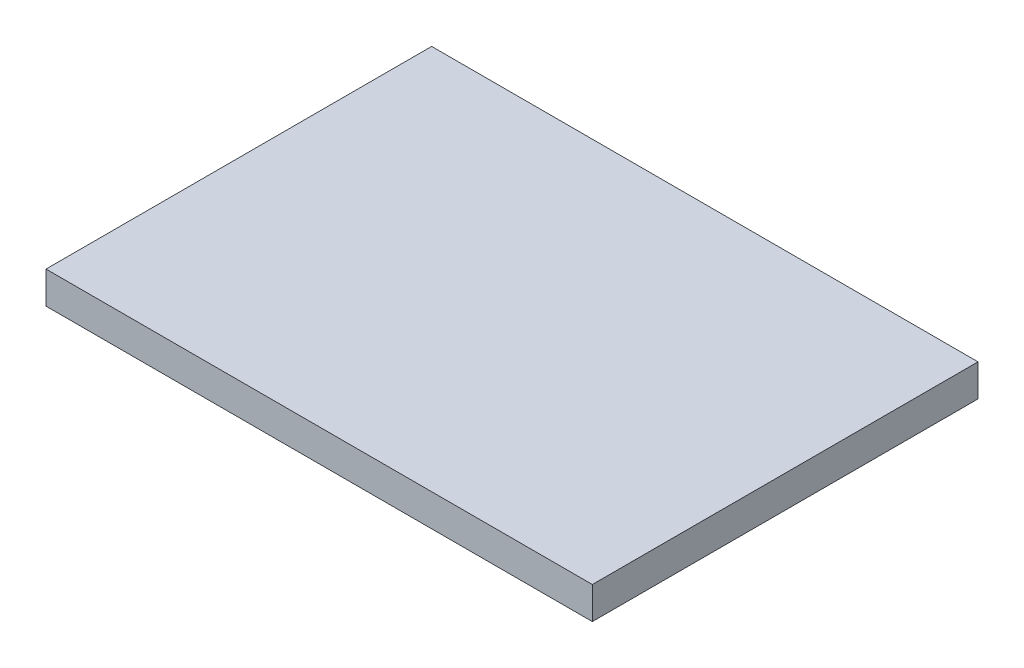
ISO-10303-21;
HEADER;
FILE_DESCRIPTION(('STEP AP214'),'2;1');
FILE_NAME('part.step','',(''),(''),'','','');
FILE_SCHEMA(('AUTOMOTIVE_DESIGN { 1 0 10303 214 1 1 1 1 }'));
ENDSEC;
DATA;
#1=APPLICATION_CONTEXT('core data for automotive mechanical design processes');
#2=APPLICATION_PROTOCOL_DEFINITION('international standard','automotive_design',2000,#1);
#3=PRODUCT_CONTEXT('',#1,'mechanical');
#4=PRODUCT('Part','Part','',(#3));
#5=PRODUCT_RELATED_PRODUCT_CATEGORY('part','',(#4));
#6=PRODUCT_DEFINITION_FORMATION('','',#4);
#7=PRODUCT_DEFINITION_CONTEXT('part definition',#1,'design');
#8=PRODUCT_DEFINITION('design','',#6,#7);
#9=PRODUCT_DEFINITION_SHAPE('','',#8);
#10=(LENGTH_UNIT() NAMED_UNIT(*) SI_UNIT(.MILLI.,.METRE.));
#11=(NAMED_UNIT(*) PLANE_ANGLE_UNIT() SI_UNIT($,.RADIAN.));
#12=(NAMED_UNIT(*) SI_UNIT($,.STERADIAN.) SOLID_ANGLE_UNIT());
#13=UNCERTAINTY_MEASURE_WITH_UNIT(LENGTH_MEASURE(1.E-05),#10,'distance_accuracy_value','');
#14=(GEOMETRIC_REPRESENTATION_CONTEXT(3) GLOBAL_UNCERTAINTY_ASSIGNED_CONTEXT((#13)) GLOBAL_UNIT_ASSIGNED_CONTEXT((#10,
#11,#12)) REPRESENTATION_CONTEXT('',''));
#15=CARTESIAN_POINT('',(0.,0.,0.));
#16=DIRECTION('',(0.,0.,1.));
#17=DIRECTION('',(1.,0.,0.));
#18=AXIS2_PLACEMENT_3D('',#15,#16,#17);
#19=CARTESIAN_POINT('',(215.9,25.4,152.4));
#20=DIRECTION('',(-1.,0.,0.));
#21=DIRECTION('',(0.,0.,1.));
#22=AXIS2_PLACEMENT_3D('',#19,#20,#21);
#23=PLANE('',#22);
#24=DIRECTION('',(0.,0.,-1.));
#25=VECTOR('',#24,1.);
#26=CARTESIAN_POINT('',(215.9,0.,152.4));
#27=LINE('',#26,#25);
#28=CARTESIAN_POINT('',(215.9,0.,152.4));
#29=VERTEX_POINT('',#28);
#30=CARTESIAN_POINT('',(215.9,0.,-152.4));
#31=VERTEX_POINT('',#30);
#32=EDGE_CURVE('E96',#29,#31,#27,.T.);
#33=ORIENTED_EDGE('',*,*,#32,.T.);
#34=DIRECTION('',(0.,-1.,0.));
#35=VECTOR('',#34,1.);
#36=CARTESIAN_POINT('',(215.9,25.4,-152.4));
#37=LINE('',#36,#35);
#38=CARTESIAN_POINT('',(215.9,25.4,-152.4));
#39=VERTEX_POINT('',#38);
#40=EDGE_CURVE('E11',#39,#31,#37,.T.);
#41=ORIENTED_EDGE('',*,*,#40,.F.);
#42=DIRECTION('',(0.,0.,-1.));
#43=VECTOR('',#42,1.);
#44=CARTESIAN_POINT('',(215.9,25.4,152.4));
#45=LINE('',#44,#43);
#46=CARTESIAN_POINT('',(215.9,25.4,152.4));
#47=VERTEX_POINT('',#46);
#48=EDGE_CURVE('E84',#47,#39,#45,.T.);
#49=ORIENTED_EDGE('',*,*,#48,.F.);
#50=DIRECTION('',(0.,-1.,0.));
#51=VECTOR('',#50,1.);
#52=CARTESIAN_POINT('',(215.9,25.4,152.4));
#53=LINE('',#52,#51);
#54=EDGE_CURVE('E92',#47,#29,#53,.T.);
#55=ORIENTED_EDGE('',*,*,#54,.T.);
#56=EDGE_LOOP('',(#33,#41,#49,#55));
#57=FACE_BOUND('',#56,.T.);
#58=ADVANCED_FACE('F33',(#57),#23,.F.);
#59=CARTESIAN_POINT('',(-215.9,25.4,-152.4));
#60=DIRECTION('',(0.,0.,1.));
#61=DIRECTION('',(1.,0.,0.));
#62=AXIS2_PLACEMENT_3D('',#59,#60,#61);
#63=PLANE('',#62);
#64=DIRECTION('',(-1.,0.,0.));
#65=VECTOR('',#64,1.);
#66=CARTESIAN_POINT('',(-215.9,0.,-152.4));
#67=LINE('',#66,#65);
#68=CARTESIAN_POINT('',(-215.9,0.,-152.4));
#69=VERTEX_POINT('',#68);
#70=EDGE_CURVE('E88',#31,#69,#67,.T.);
#71=ORIENTED_EDGE('',*,*,#70,.T.);
#72=DIRECTION('',(0.,-1.,0.));
#73=VECTOR('',#72,1.);
#74=CARTESIAN_POINT('',(-215.9,25.4,-152.4));
#75=LINE('',#74,#73);
#76=CARTESIAN_POINT('',(-215.9,25.4,-152.4));
#77=VERTEX_POINT('',#76);
#78=EDGE_CURVE('E41',#77,#69,#75,.T.);
#79=ORIENTED_EDGE('',*,*,#78,.F.);
#80=DIRECTION('',(-1.,0.,0.));
#81=VECTOR('',#80,1.);
#82=CARTESIAN_POINT('',(-215.9,25.4,-152.4));
#83=LINE('',#82,#81);
#84=EDGE_CURVE('E79',#39,#77,#83,.T.);
#85=ORIENTED_EDGE('',*,*,#84,.F.);
#86=ORIENTED_EDGE('',*,*,#40,.T.);
#87=EDGE_LOOP('',(#71,#79,#85,#86));
#88=FACE_BOUND('',#87,.T.);
#89=ADVANCED_FACE('F87',(#88),#63,.F.);
#90=CARTESIAN_POINT('',(-215.9,25.4,152.4));
#91=DIRECTION('',(1.,0.,0.));
#92=DIRECTION('',(0.,0.,-1.));
#93=AXIS2_PLACEMENT_3D('',#90,#91,#92);
#94=PLANE('',#93);
#95=DIRECTION('',(0.,0.,1.));
#96=VECTOR('',#95,1.);
#97=CARTESIAN_POINT('',(-215.9,0.,152.4));
#98=LINE('',#97,#96);
#99=CARTESIAN_POINT('',(-215.9,0.,152.4));
#100=VERTEX_POINT('',#99);
#101=EDGE_CURVE('E66',#69,#100,#98,.T.);
#102=ORIENTED_EDGE('',*,*,#101,.T.);
#103=DIRECTION('',(0.,-1.,0.));
#104=VECTOR('',#103,1.);
#105=CARTESIAN_POINT('',(-215.9,25.4,152.4));
#106=LINE('',#105,#104);
#107=CARTESIAN_POINT('',(-215.9,25.4,152.4));
#108=VERTEX_POINT('',#107);
#109=EDGE_CURVE('E89',#108,#100,#106,.T.);
#110=ORIENTED_EDGE('',*,*,#109,.F.);
#111=DIRECTION('',(0.,0.,1.));
#112=VECTOR('',#111,1.);
#113=CARTESIAN_POINT('',(-215.9,25.4,152.4));
#114=LINE('',#113,#112);
#115=EDGE_CURVE('E82',#77,#108,#114,.T.);
#116=ORIENTED_EDGE('',*,*,#115,.F.);
#117=ORIENTED_EDGE('',*,*,#78,.T.);
#118=EDGE_LOOP('',(#102,#110,#116,#117));
#119=FACE_BOUND('',#118,.T.);
#120=ADVANCED_FACE('F90',(#119),#94,.F.);
#121=CARTESIAN_POINT('',(-215.9,25.4,152.4));
#122=DIRECTION('',(0.,0.,-1.));
#123=DIRECTION('',(-1.,0.,0.));
#124=AXIS2_PLACEMENT_3D('',#121,#122,#123);
#125=PLANE('',#124);
#126=DIRECTION('',(1.,0.,0.));
#127=VECTOR('',#126,1.);
#128=CARTESIAN_POINT('',(-215.9,0.,152.4));
#129=LINE('',#128,#127);
#130=EDGE_CURVE('E72',#100,#29,#129,.T.);
#131=ORIENTED_EDGE('',*,*,#130,.T.);
#132=ORIENTED_EDGE('',*,*,#54,.F.);
#133=DIRECTION('',(1.,0.,0.));
#134=VECTOR('',#133,1.);
#135=CARTESIAN_POINT('',(-215.9,25.4,152.4));
#136=LINE('',#135,#134);
#137=EDGE_CURVE('E49',#108,#47,#136,.T.);
#138=ORIENTED_EDGE('',*,*,#137,.F.);
#139=ORIENTED_EDGE('',*,*,#109,.T.);
#140=EDGE_LOOP('',(#131,#132,#138,#139));
#141=FACE_BOUND('',#140,.T.);
#142=ADVANCED_FACE('F103',(#141),#125,.F.);
#143=CARTESIAN_POINT('',(0.,25.4,0.));
#144=DIRECTION('',(0.,-1.,0.));
#145=DIRECTION('',(0.,0.,-1.));
#146=AXIS2_PLACEMENT_3D('',#143,#144,#145);
#147=PLANE('',#146);
#148=ORIENTED_EDGE('',*,*,#48,.T.);
#149=ORIENTED_EDGE('',*,*,#84,.T.);
#150=ORIENTED_EDGE('',*,*,#115,.T.);
#151=ORIENTED_EDGE('',*,*,#137,.T.);
#152=EDGE_LOOP('',(#148,#149,#150,#151));
#153=FACE_BOUND('',#152,.T.);
#154=ADVANCED_FACE('F80',(#153),#147,.F.);
#155=CARTESIAN_POINT('',(0.,0.,0.));
#156=DIRECTION('',(0.,-1.,0.));
#157=DIRECTION('',(0.,0.,-1.));
#158=AXIS2_PLACEMENT_3D('',#155,#156,#157);
#159=PLANE('',#158);
#160=ORIENTED_EDGE('',*,*,#32,.F.);
#161=ORIENTED_EDGE('',*,*,#130,.F.);
#162=ORIENTED_EDGE('',*,*,#101,.F.);
#163=ORIENTED_EDGE('',*,*,#70,.F.);
#164=EDGE_LOOP('',(#160,#161,#162,#163));
#165=FACE_BOUND('',#164,.T.);
#166=ADVANCED_FACE('F106',(#165),#159,.T.);
#167=CLOSED_SHELL('',(#58,#89,#120,#142,#154,#166));
#168=MANIFOLD_SOLID_BREP('B2',#167);
#169=ADVANCED_BREP_SHAPE_REPRESENTATION('',(#18,#168),#14);
#170=SHAPE_DEFINITION_REPRESENTATION(#9,#169);
ENDSEC;
END-ISO-10303-21;
